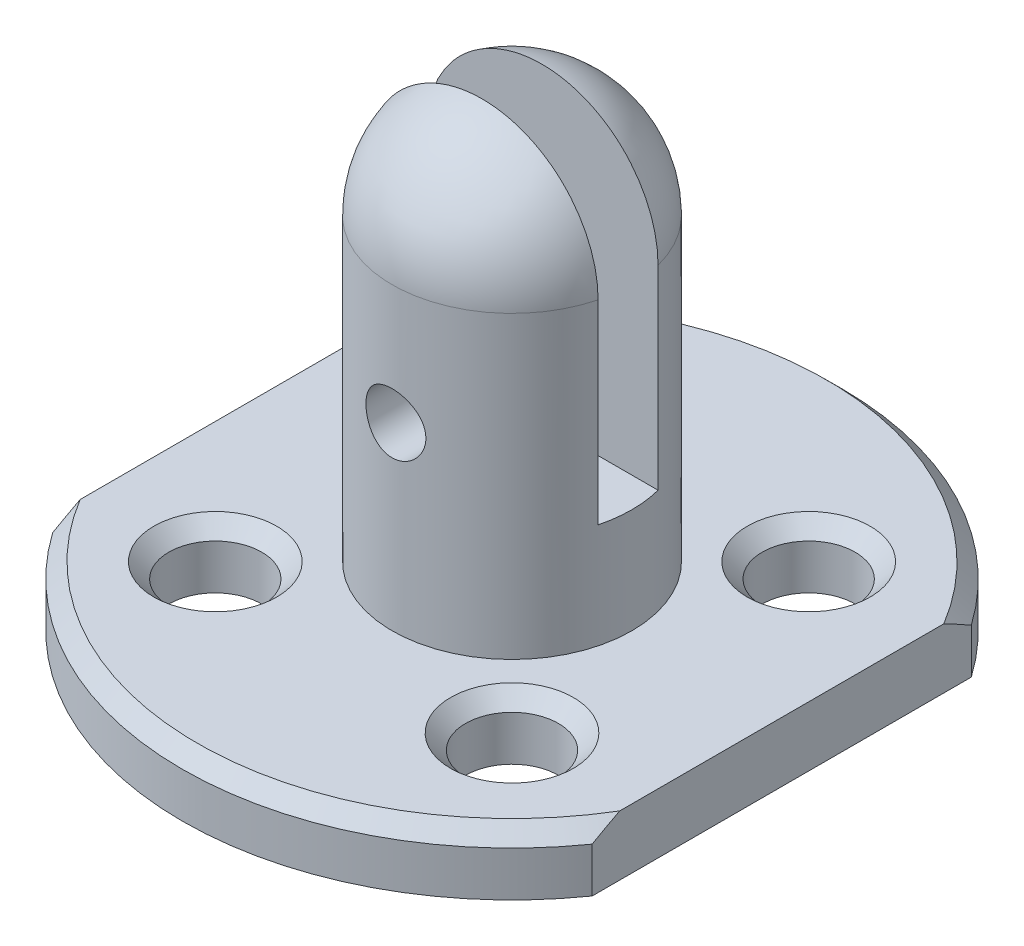
ISO-10303-21;
HEADER;
FILE_DESCRIPTION(('STEP AP214'),'2;1');
FILE_NAME('part.step','',(''),(''),'','','');
FILE_SCHEMA(('AUTOMOTIVE_DESIGN { 1 0 10303 214 1 1 1 1 }'));
ENDSEC;
DATA;
#1=APPLICATION_CONTEXT('core data for automotive mechanical design processes');
#2=APPLICATION_PROTOCOL_DEFINITION('international standard','automotive_design',2000,#1);
#3=PRODUCT_CONTEXT('',#1,'mechanical');
#4=PRODUCT('Part','Part','',(#3));
#5=PRODUCT_RELATED_PRODUCT_CATEGORY('part','',(#4));
#6=PRODUCT_DEFINITION_FORMATION('','',#4);
#7=PRODUCT_DEFINITION_CONTEXT('part definition',#1,'design');
#8=PRODUCT_DEFINITION('design','',#6,#7);
#9=PRODUCT_DEFINITION_SHAPE('','',#8);
#10=(LENGTH_UNIT() NAMED_UNIT(*) SI_UNIT(.MILLI.,.METRE.));
#11=(NAMED_UNIT(*) PLANE_ANGLE_UNIT() SI_UNIT($,.RADIAN.));
#12=(NAMED_UNIT(*) SI_UNIT($,.STERADIAN.) SOLID_ANGLE_UNIT());
#13=UNCERTAINTY_MEASURE_WITH_UNIT(LENGTH_MEASURE(1.E-05),#10,'distance_accuracy_value','');
#14=(GEOMETRIC_REPRESENTATION_CONTEXT(3) GLOBAL_UNCERTAINTY_ASSIGNED_CONTEXT((#13)) GLOBAL_UNIT_ASSIGNED_CONTEXT((#10,
#11,#12)) REPRESENTATION_CONTEXT('',''));
#15=CARTESIAN_POINT('',(0.,0.,0.));
#16=DIRECTION('',(0.,0.,1.));
#17=DIRECTION('',(1.,0.,0.));
#18=AXIS2_PLACEMENT_3D('',#15,#16,#17);
#19=CARTESIAN_POINT('',(0.,2.,0.));
#20=DIRECTION('',(0.,-1.,0.));
#21=DIRECTION('',(1.,0.,0.));
#22=AXIS2_PLACEMENT_3D('',#19,#20,#21);
#23=CYLINDRICAL_SURFACE('',#22,4.);
#24=CARTESIAN_POINT('',(1.,8.,-3.87298334620742));
#25=CARTESIAN_POINT('',(0.999998431438699,7.94477969964322,-3.87298440057185));
#26=CARTESIAN_POINT('',(0.99541049820807,7.88954204056864,-3.87417722499279));
#27=CARTESIAN_POINT('',(0.977209250194446,7.78065296876739,-3.87880744892249));
#28=CARTESIAN_POINT('',(0.963590682698078,7.72700249822004,-3.88224615474181));
#29=CARTESIAN_POINT('',(0.927796479849635,7.62287858471216,-3.89095489813012));
#30=CARTESIAN_POINT('',(0.905631891140944,7.57240113784224,-3.8962225706936));
#31=CARTESIAN_POINT('',(0.853408456505407,7.47587565898752,-3.90799276818327));
#32=CARTESIAN_POINT('',(0.823349275424505,7.42982781516885,-3.91449534553241));
#33=CARTESIAN_POINT('',(0.755483370924517,7.34245534189415,-3.92816286540368));
#34=CARTESIAN_POINT('',(0.717534755081557,7.30124255985972,-3.93533839048709));
#35=CARTESIAN_POINT('',(0.635272825640328,7.22569544225612,-3.94945150206622));
#36=CARTESIAN_POINT('',(0.590958917672139,7.19136174975137,-3.95638906626691));
#37=CARTESIAN_POINT('',(0.496458080431564,7.13008981294742,-3.96936166208095));
#38=CARTESIAN_POINT('',(0.446197830478043,7.10326144473539,-3.975382749602));
#39=CARTESIAN_POINT('',(0.34170527371711,7.05847614233878,-3.98572324770431));
#40=CARTESIAN_POINT('',(0.287473554316778,7.0405178992338,-3.99004290933748));
#41=CARTESIAN_POINT('',(0.177743503501664,7.01434086616856,-3.99641903539263));
#42=CARTESIAN_POINT('',(0.12229308781959,7.00593214226937,-3.99851957537723));
#43=CARTESIAN_POINT('',(0.0107315277051083,6.99849664828978,-4.00037437642922));
#44=CARTESIAN_POINT('',(-0.0453795178152272,6.99946849111616,-4.00012898438682));
#45=CARTESIAN_POINT('',(-0.155352247172387,7.01062994010006,-3.99735237981413));
#46=CARTESIAN_POINT('',(-0.209236215601067,7.02061453002154,-3.9948720093635));
#47=CARTESIAN_POINT('',(-0.314538247413686,7.0491885080194,-3.98796334609942));
#48=CARTESIAN_POINT('',(-0.365956179370438,7.06777835415096,-3.98353494959377));
#49=CARTESIAN_POINT('',(-0.465406703501807,7.11320102827483,-3.97315003880358));
#50=CARTESIAN_POINT('',(-0.513404509766505,7.1401068178647,-3.96718007878022));
#51=CARTESIAN_POINT('',(-0.604275622340489,7.2013422716465,-3.9543596152386));
#52=CARTESIAN_POINT('',(-0.647148035085505,7.23567322742425,-3.94750895860996));
#53=CARTESIAN_POINT('',(-0.727774035084956,7.31188349679295,-3.93345485507808));
#54=CARTESIAN_POINT('',(-0.765357679075199,7.35394195693911,-3.92624687810367));
#55=CARTESIAN_POINT('',(-0.832976375963019,7.4438399894161,-3.91246017406683));
#56=CARTESIAN_POINT('',(-0.863011076046017,7.4916798317964,-3.90588147642388));
#57=CARTESIAN_POINT('',(-0.914788129022598,7.59211601365959,-3.8940819873266));
#58=CARTESIAN_POINT('',(-0.936489566970491,7.64473429212528,-3.88886793490289));
#59=CARTESIAN_POINT('',(-0.970685620636341,7.75303418723058,-3.88047456055983));
#60=CARTESIAN_POINT('',(-0.98318220655291,7.80871514559325,-3.87729480324088));
#61=CARTESIAN_POINT('',(-0.998331855466071,7.91998380060925,-3.87342142415656));
#62=CARTESIAN_POINT('',(-1.00123618956785,7.97553511733185,-3.87266435637459));
#63=CARTESIAN_POINT('',(-0.997806796206219,8.08632877463126,-3.87354937392416));
#64=CARTESIAN_POINT('',(-0.99147391913952,8.1415711431805,-3.87519123840507));
#65=CARTESIAN_POINT('',(-0.969970185575065,8.24924570598188,-3.88062832781824));
#66=CARTESIAN_POINT('',(-0.954945627312699,8.30170909062834,-3.8843878809375));
#67=CARTESIAN_POINT('',(-0.916647232668249,8.40337258314067,-3.89360287308385));
#68=CARTESIAN_POINT('',(-0.893372419085019,8.45257230362214,-3.89905851299446));
#69=CARTESIAN_POINT('',(-0.838708267174624,8.54737651114694,-3.91118454837305));
#70=CARTESIAN_POINT('',(-0.807168701534253,8.59289153601724,-3.91787667442657));
#71=CARTESIAN_POINT('',(-0.737060292934457,8.67807534512054,-3.93166833228686));
#72=CARTESIAN_POINT('',(-0.69849029480544,8.71774316666003,-3.93876793091388));
#73=CARTESIAN_POINT('',(-0.614262720984726,8.79112441702838,-3.95278961212643));
#74=CARTESIAN_POINT('',(-0.568451952531592,8.82466402501953,-3.95970280824734));
#75=CARTESIAN_POINT('',(-0.471702682694675,8.8835743467805,-3.97238886645494));
#76=CARTESIAN_POINT('',(-0.420764448957591,8.90894548664328,-3.97816178801584));
#77=CARTESIAN_POINT('',(-0.31555820173109,8.95057841381117,-3.98788046295326));
#78=CARTESIAN_POINT('',(-0.261317381027881,8.96690571375162,-3.99183932008964));
#79=CARTESIAN_POINT('',(-0.150749760318808,8.99018413384337,-3.99754117358315));
#80=CARTESIAN_POINT('',(-0.0944233650412434,8.99713706349562,-3.99928459757364));
#81=CARTESIAN_POINT('',(0.0170835264433263,9.00136758957554,-4.00034169408811));
#82=CARTESIAN_POINT('',(0.0722538269660329,8.99890170909539,-3.99971978880009));
#83=CARTESIAN_POINT('',(0.181367496414739,8.98495217270567,-3.99625896457424));
#84=CARTESIAN_POINT('',(0.235310901780887,8.9734687849869,-3.99342011157095));
#85=CARTESIAN_POINT('',(0.340171035644816,8.94194778022907,-3.98585432853963));
#86=CARTESIAN_POINT('',(0.391102494581019,8.92195654668538,-3.98113764502669));
#87=CARTESIAN_POINT('',(0.488917053041468,8.87402942098067,-3.97031288913382));
#88=CARTESIAN_POINT('',(0.535799641265051,8.84609252733043,-3.96420464137727));
#89=CARTESIAN_POINT('',(0.6254019284239,8.78228476600293,-3.95107249681343));
#90=CARTESIAN_POINT('',(0.667994988300587,8.74623985709263,-3.94403016945647));
#91=CARTESIAN_POINT('',(0.746615020271251,8.66757714802619,-3.92990649053207));
#92=CARTESIAN_POINT('',(0.782640325068177,8.62495768390206,-3.92282512952424));
#93=CARTESIAN_POINT('',(0.84776202647924,8.53339858579871,-3.90927475860683));
#94=CARTESIAN_POINT('',(0.876716619446594,8.48435587658752,-3.90281963730391));
#95=CARTESIAN_POINT('',(0.925926896615622,8.38194451007715,-3.8914395555011));
#96=CARTESIAN_POINT('',(0.946188909759557,8.32857903389271,-3.88651348244814));
#97=CARTESIAN_POINT('',(0.974422528565571,8.22942298817373,-3.87951908741315));
#98=CARTESIAN_POINT('',(0.983993170595829,8.18410683561764,-3.87708663005761));
#99=CARTESIAN_POINT('',(0.996782292572819,8.09253113099854,-3.87381838580358));
#100=CARTESIAN_POINT('',(1.00000131437052,8.04627165974937,-3.87298246270639));
#101=CARTESIAN_POINT('',(1.,8.,-3.87298334620742));
#102=B_SPLINE_CURVE_WITH_KNOTS('',3,(#24,#25,#26,#27,#28,#29,#30,#31,#32,#33,#34,#35,#36,#37,
#38,#39,#40,#41,#42,#43,#44,#45,#46,#47,#48,#49,#50,#51,#52,#53,#54,#55,#56,#57,#58,#59,#60,#61,
#62,#63,#64,#65,#66,#67,#68,#69,#70,#71,#72,#73,#74,#75,#76,#77,#78,#79,#80,#81,#82,#83,#84,#85,
#86,#87,#88,#89,#90,#91,#92,#93,#94,#95,#96,#97,#98,#99,#100,#101),.UNSPECIFIED.,.T.,.F.,(4,2,2,
2,2,2,2,2,2,2,2,2,2,2,2,2,2,2,2,2,2,2,2,2,2,2,2,2,2,2,2,2,2,2,2,2,2,2,4),(0.,0.165490976675229,
0.331078296534211,0.496452290829153,0.661833306984659,0.83049581673465,0.999174085882212,
1.17020598555443,1.34121263935111,1.50875500394413,1.67627259462683,1.84007305071853,
2.00388222686189,2.16917149698052,2.3344895418384,2.50428186625039,2.67408212476195,
2.84470572799636,3.01529280048093,3.18137429900961,3.34744050869795,3.51078961999957,
3.67415808564842,3.84073138339937,4.00733207550292,4.17810132382402,4.34886166284096,
4.51836829119046,4.6878421955989,4.85273378447257,5.01762046947067,5.18161950620159,
5.34563922291504,5.51358838629103,5.68158012622478,5.85270590910146,6.02370688542922,
6.16239130867206,6.30106390036083),.UNSPECIFIED.);
#103=CARTESIAN_POINT('',(1.,8.,-3.87298334620742));
#104=VERTEX_POINT('',#103);
#105=EDGE_CURVE('E129',#104,#104,#102,.T.);
#106=ORIENTED_EDGE('',*,*,#105,.F.);
#107=EDGE_LOOP('',(#106));
#108=FACE_BOUND('',#107,.T.);
#109=CARTESIAN_POINT('',(1.,8.,3.87298334620742));
#110=CARTESIAN_POINT('',(0.999998431438699,8.05522030035679,3.87298440057185));
#111=CARTESIAN_POINT('',(0.99541049820807,8.11045795943136,3.87417722499279));
#112=CARTESIAN_POINT('',(0.977209250194446,8.21934703123261,3.87880744892249));
#113=CARTESIAN_POINT('',(0.963590682698078,8.27299750177997,3.88224615474181));
#114=CARTESIAN_POINT('',(0.927796479849635,8.37712141528784,3.89095489813012));
#115=CARTESIAN_POINT('',(0.905631891140944,8.42759886215776,3.8962225706936));
#116=CARTESIAN_POINT('',(0.853408456505407,8.52412434101248,3.90799276818327));
#117=CARTESIAN_POINT('',(0.823349275424505,8.57017218483115,3.91449534553241));
#118=CARTESIAN_POINT('',(0.755483370924518,8.65754465810585,3.92816286540368));
#119=CARTESIAN_POINT('',(0.717534755081558,8.69875744014028,3.93533839048709));
#120=CARTESIAN_POINT('',(0.635272825640329,8.77430455774388,3.94945150206622));
#121=CARTESIAN_POINT('',(0.590958917672141,8.80863825024863,3.95638906626691));
#122=CARTESIAN_POINT('',(0.496458080431566,8.86991018705258,3.96936166208095));
#123=CARTESIAN_POINT('',(0.446197830478045,8.8967385552646,3.975382749602));
#124=CARTESIAN_POINT('',(0.34170527371711,8.94152385766122,3.98572324770431));
#125=CARTESIAN_POINT('',(0.287473554316778,8.9594821007662,3.99004290933748));
#126=CARTESIAN_POINT('',(0.177743503501663,8.98565913383144,3.99641903539263));
#127=CARTESIAN_POINT('',(0.122293087819589,8.99406785773063,3.99851957537723));
#128=CARTESIAN_POINT('',(0.0107315277051076,9.00150335171022,4.00037437642922));
#129=CARTESIAN_POINT('',(-0.0453795178152278,9.00053150888384,4.00012898438682));
#130=CARTESIAN_POINT('',(-0.155352247172388,8.98937005989994,3.99735237981413));
#131=CARTESIAN_POINT('',(-0.209236215601068,8.97938546997846,3.9948720093635));
#132=CARTESIAN_POINT('',(-0.314538247413687,8.9508114919806,3.98796334609942));
#133=CARTESIAN_POINT('',(-0.365956179370439,8.93222164584904,3.98353494959377));
#134=CARTESIAN_POINT('',(-0.465406703501807,8.88679897172517,3.97315003880358));
#135=CARTESIAN_POINT('',(-0.513404509766505,8.8598931821353,3.96718007878022));
#136=CARTESIAN_POINT('',(-0.60427562234049,8.7986577283535,3.9543596152386));
#137=CARTESIAN_POINT('',(-0.647148035085506,8.76432677257575,3.94750895860996));
#138=CARTESIAN_POINT('',(-0.727774035084957,8.68811650320705,3.93345485507808));
#139=CARTESIAN_POINT('',(-0.7653576790752,8.64605804306089,3.92624687810367));
#140=CARTESIAN_POINT('',(-0.832976375963019,8.5561600105839,3.91246017406683));
#141=CARTESIAN_POINT('',(-0.863011076046017,8.5083201682036,3.90588147642388));
#142=CARTESIAN_POINT('',(-0.914788129022599,8.40788398634041,3.8940819873266));
#143=CARTESIAN_POINT('',(-0.936489566970491,8.35526570787472,3.88886793490289));
#144=CARTESIAN_POINT('',(-0.970685620636341,8.24696581276942,3.88047456055983));
#145=CARTESIAN_POINT('',(-0.98318220655291,8.19128485440675,3.87729480324088));
#146=CARTESIAN_POINT('',(-0.998331855466071,8.08001619939075,3.87342142415656));
#147=CARTESIAN_POINT('',(-1.00123618956785,8.02446488266815,3.87266435637459));
#148=CARTESIAN_POINT('',(-0.997806796206219,7.91367122536874,3.87354937392416));
#149=CARTESIAN_POINT('',(-0.99147391913952,7.8584288568195,3.87519123840507));
#150=CARTESIAN_POINT('',(-0.969970185575065,7.75075429401812,3.88062832781824));
#151=CARTESIAN_POINT('',(-0.954945627312698,7.69829090937166,3.8843878809375));
#152=CARTESIAN_POINT('',(-0.916647232668248,7.59662741685933,3.89360287308385));
#153=CARTESIAN_POINT('',(-0.893372419085018,7.54742769637786,3.89905851299446));
#154=CARTESIAN_POINT('',(-0.838708267174623,7.45262348885306,3.91118454837305));
#155=CARTESIAN_POINT('',(-0.807168701534252,7.40710846398276,3.91787667442657));
#156=CARTESIAN_POINT('',(-0.737060292934456,7.32192465487946,3.93166833228687));
#157=CARTESIAN_POINT('',(-0.69849029480544,7.28225683333997,3.93876793091388));
#158=CARTESIAN_POINT('',(-0.614262720984726,7.20887558297162,3.95278961212643));
#159=CARTESIAN_POINT('',(-0.568451952531592,7.17533597498047,3.95970280824734));
#160=CARTESIAN_POINT('',(-0.471702682694675,7.1164256532195,3.97238886645494));
#161=CARTESIAN_POINT('',(-0.420764448957591,7.09105451335672,3.97816178801584));
#162=CARTESIAN_POINT('',(-0.31555820173109,7.04942158618883,3.98788046295326));
#163=CARTESIAN_POINT('',(-0.261317381027882,7.03309428624838,3.99183932008964));
#164=CARTESIAN_POINT('',(-0.150749760318808,7.00981586615663,3.99754117358315));
#165=CARTESIAN_POINT('',(-0.0944233650412438,7.00286293650438,3.99928459757364));
#166=CARTESIAN_POINT('',(0.0170835264433264,6.99863241042447,4.00034169408811));
#167=CARTESIAN_POINT('',(0.0722538269660333,7.00109829090461,3.99971978880009));
#168=CARTESIAN_POINT('',(0.18136749641474,7.01504782729433,3.99625896457424));
#169=CARTESIAN_POINT('',(0.235310901780887,7.0265312150131,3.99342011157095));
#170=CARTESIAN_POINT('',(0.340171035644817,7.05805221977093,3.98585432853964));
#171=CARTESIAN_POINT('',(0.39110249458102,7.07804345331462,3.98113764502669));
#172=CARTESIAN_POINT('',(0.488917053041469,7.12597057901933,3.97031288913382));
#173=CARTESIAN_POINT('',(0.535799641265051,7.15390747266957,3.96420464137727));
#174=CARTESIAN_POINT('',(0.625401928423901,7.21771523399707,3.95107249681343));
#175=CARTESIAN_POINT('',(0.667994988300588,7.25376014290737,3.94403016945647));
#176=CARTESIAN_POINT('',(0.746615020271253,7.33242285197381,3.92990649053207));
#177=CARTESIAN_POINT('',(0.782640325068179,7.37504231609795,3.92282512952424));
#178=CARTESIAN_POINT('',(0.847762026479241,7.4666014142013,3.90927475860683));
#179=CARTESIAN_POINT('',(0.876716619446594,7.51564412341248,3.90281963730391));
#180=CARTESIAN_POINT('',(0.925926896615623,7.61805548992285,3.8914395555011));
#181=CARTESIAN_POINT('',(0.946188909759557,7.67142096610729,3.88651348244814));
#182=CARTESIAN_POINT('',(0.974422528565572,7.77057701182628,3.87951908741315));
#183=CARTESIAN_POINT('',(0.983993170595829,7.81589316438236,3.87708663005761));
#184=CARTESIAN_POINT('',(0.99678229257282,7.90746886900147,3.87381838580358));
#185=CARTESIAN_POINT('',(1.00000131437052,7.95372834025063,3.87298246270639));
#186=CARTESIAN_POINT('',(1.,8.,3.87298334620742));
#187=B_SPLINE_CURVE_WITH_KNOTS('',3,(#109,#110,#111,#112,#113,#114,#115,#116,#117,#118,#119,
#120,#121,#122,#123,#124,#125,#126,#127,#128,#129,#130,#131,#132,#133,#134,#135,#136,#137,#138,
#139,#140,#141,#142,#143,#144,#145,#146,#147,#148,#149,#150,#151,#152,#153,#154,#155,#156,#157,
#158,#159,#160,#161,#162,#163,#164,#165,#166,#167,#168,#169,#170,#171,#172,#173,#174,#175,#176,
#177,#178,#179,#180,#181,#182,#183,#184,#185,#186),.UNSPECIFIED.,.T.,.F.,(4,2,2,2,2,2,2,2,2,2,2,
2,2,2,2,2,2,2,2,2,2,2,2,2,2,2,2,2,2,2,2,2,2,2,2,2,2,2,4),(0.,0.165490976675229,
0.331078296534212,0.496452290829153,0.661833306984659,0.830495816734648,0.99917408588221,
1.17020598555442,1.34121263935111,1.50875500394413,1.67627259462683,1.84007305071853,
2.00388222686189,2.16917149698052,2.3344895418384,2.50428186625039,2.67408212476196,
2.84470572799636,3.01529280048094,3.18137429900961,3.34744050869796,3.51078961999957,
3.67415808564842,3.84073138339938,4.00733207550292,4.17810132382402,4.34886166284096,
4.51836829119046,4.6878421955989,4.85273378447257,5.01762046947067,5.18161950620159,
5.34563922291504,5.51358838629103,5.68158012622479,5.85270590910146,6.02370688542923,
6.16239130867207,6.30106390036083),.UNSPECIFIED.);
#188=CARTESIAN_POINT('',(1.,8.,3.87298334620742));
#189=VERTEX_POINT('',#188);
#190=EDGE_CURVE('E146',#189,#189,#187,.T.);
#191=ORIENTED_EDGE('',*,*,#190,.F.);
#192=EDGE_LOOP('',(#191));
#193=FACE_BOUND('',#192,.T.);
#194=CARTESIAN_POINT('',(0.,2.,0.));
#195=DIRECTION('',(0.,-1.,0.));
#196=DIRECTION('',(1.,0.,0.));
#197=AXIS2_PLACEMENT_3D('',#194,#195,#196);
#198=CIRCLE('',#197,4.);
#199=CARTESIAN_POINT('',(4.,2.,0.));
#200=VERTEX_POINT('',#199);
#201=EDGE_CURVE('E207',#200,#200,#198,.T.);
#202=ORIENTED_EDGE('',*,*,#201,.F.);
#203=EDGE_LOOP('',(#202));
#204=FACE_BOUND('',#203,.T.);
#205=CARTESIAN_POINT('',(0.,5.5,0.));
#206=DIRECTION('',(0.,-1.,0.));
#207=DIRECTION('',(0.,0.,-1.));
#208=AXIS2_PLACEMENT_3D('',#205,#206,#207);
#209=CIRCLE('',#208,4.);
#210=CARTESIAN_POINT('',(3.87298334620741,5.5,1.));
#211=VERTEX_POINT('',#210);
#212=CARTESIAN_POINT('',(3.87298334620741,5.5,-1.));
#213=VERTEX_POINT('',#212);
#214=EDGE_CURVE('E44',#211,#213,#209,.F.);
#215=ORIENTED_EDGE('',*,*,#214,.F.);
#216=DIRECTION('',(0.,-1.,0.));
#217=VECTOR('',#216,1.);
#218=CARTESIAN_POINT('',(3.87298334620742,2.,1.));
#219=LINE('',#218,#217);
#220=CARTESIAN_POINT('',(3.87298334620742,12.,1.));
#221=VERTEX_POINT('',#220);
#222=EDGE_CURVE('E591',#211,#221,#219,.F.);
#223=ORIENTED_EDGE('',*,*,#222,.T.);
#224=CARTESIAN_POINT('',(0.,12.,0.));
#225=DIRECTION('',(0.,-1.,0.));
#226=DIRECTION('',(1.,0.,0.));
#227=AXIS2_PLACEMENT_3D('',#224,#225,#226);
#228=CIRCLE('',#227,4.);
#229=CARTESIAN_POINT('',(-3.87298334620741,12.,1.));
#230=VERTEX_POINT('',#229);
#231=EDGE_CURVE('E210',#221,#230,#228,.T.);
#232=ORIENTED_EDGE('',*,*,#231,.T.);
#233=DIRECTION('',(0.,-1.,0.));
#234=VECTOR('',#233,1.);
#235=CARTESIAN_POINT('',(-3.87298334620742,2.,1.));
#236=LINE('',#235,#234);
#237=CARTESIAN_POINT('',(-3.87298334620742,5.5,1.));
#238=VERTEX_POINT('',#237);
#239=EDGE_CURVE('E133',#230,#238,#236,.T.);
#240=ORIENTED_EDGE('',*,*,#239,.T.);
#241=CARTESIAN_POINT('',(-3.87298334620742,5.5,-1.));
#242=VERTEX_POINT('',#241);
#243=EDGE_CURVE('E126',#242,#238,#209,.F.);
#244=ORIENTED_EDGE('',*,*,#243,.F.);
#245=DIRECTION('',(0.,-1.,0.));
#246=VECTOR('',#245,1.);
#247=CARTESIAN_POINT('',(-3.87298334620742,2.,-0.999999999999999));
#248=LINE('',#247,#246);
#249=CARTESIAN_POINT('',(-3.87298334620741,12.,-0.999999999999999));
#250=VERTEX_POINT('',#249);
#251=EDGE_CURVE('E112',#250,#242,#248,.T.);
#252=ORIENTED_EDGE('',*,*,#251,.F.);
#253=CARTESIAN_POINT('',(3.87298334620742,12.,-0.999999999999999));
#254=VERTEX_POINT('',#253);
#255=EDGE_CURVE('E215',#250,#254,#228,.T.);
#256=ORIENTED_EDGE('',*,*,#255,.T.);
#257=DIRECTION('',(0.,-1.,0.));
#258=VECTOR('',#257,1.);
#259=CARTESIAN_POINT('',(3.87298334620742,2.,-0.999999999999999));
#260=LINE('',#259,#258);
#261=EDGE_CURVE('E51',#213,#254,#260,.F.);
#262=ORIENTED_EDGE('',*,*,#261,.F.);
#263=EDGE_LOOP('',(#215,#223,#232,#240,#244,#252,#256,#262));
#264=FACE_BOUND('',#263,.T.);
#265=ADVANCED_FACE('F34',(#108,#193,#204,#264),#23,.T.);
#266=CARTESIAN_POINT('',(0.,12.,0.));
#267=DIRECTION('',(0.,-1.,0.));
#268=DIRECTION('',(1.,0.,0.));
#269=AXIS2_PLACEMENT_3D('',#266,#267,#268);
#270=SPHERICAL_SURFACE('',#269,4.);
#271=ORIENTED_EDGE('',*,*,#231,.F.);
#272=CARTESIAN_POINT('',(0.,12.,1.));
#273=DIRECTION('',(0.,0.,-1.));
#274=DIRECTION('',(-1.,0.,0.));
#275=AXIS2_PLACEMENT_3D('',#272,#273,#274);
#276=CIRCLE('',#275,3.87298334620741);
#277=EDGE_CURVE('E134',#221,#230,#276,.F.);
#278=ORIENTED_EDGE('',*,*,#277,.T.);
#279=EDGE_LOOP('',(#271,#278));
#280=FACE_BOUND('',#279,.T.);
#281=ADVANCED_FACE('F187',(#280),#270,.T.);
#282=CARTESIAN_POINT('',(0.,2.,0.));
#283=DIRECTION('',(0.,-1.,0.));
#284=DIRECTION('',(0.,0.,-1.));
#285=AXIS2_PLACEMENT_3D('',#282,#283,#284);
#286=CYLINDRICAL_SURFACE('',#285,11.);
#287=DIRECTION('',(0.,-1.,0.));
#288=VECTOR('',#287,1.);
#289=CARTESIAN_POINT('',(8.99999999999999,2.,6.32455532033676));
#290=LINE('',#289,#288);
#291=CARTESIAN_POINT('',(8.99999999999999,1.5,6.32455532033676));
#292=VERTEX_POINT('',#291);
#293=CARTESIAN_POINT('',(8.99999999999999,0.,6.32455532033676));
#294=VERTEX_POINT('',#293);
#295=EDGE_CURVE('E251',#292,#294,#290,.T.);
#296=ORIENTED_EDGE('',*,*,#295,.F.);
#297=CARTESIAN_POINT('',(0.,1.5,0.));
#298=DIRECTION('',(0.,1.,0.));
#299=DIRECTION('',(0.,0.,1.));
#300=AXIS2_PLACEMENT_3D('',#297,#298,#299);
#301=CIRCLE('',#300,11.);
#302=CARTESIAN_POINT('',(-9.,1.5,6.32455532033676));
#303=VERTEX_POINT('',#302);
#304=EDGE_CURVE('E397',#292,#303,#301,.F.);
#305=ORIENTED_EDGE('',*,*,#304,.T.);
#306=DIRECTION('',(0.,-1.,0.));
#307=VECTOR('',#306,1.);
#308=CARTESIAN_POINT('',(-9.,2.,6.32455532033676));
#309=LINE('',#308,#307);
#310=CARTESIAN_POINT('',(-9.,0.,6.32455532033676));
#311=VERTEX_POINT('',#310);
#312=EDGE_CURVE('E235',#303,#311,#309,.T.);
#313=ORIENTED_EDGE('',*,*,#312,.T.);
#314=CARTESIAN_POINT('',(0.,0.,0.));
#315=DIRECTION('',(0.,1.,0.));
#316=DIRECTION('',(0.,0.,1.));
#317=AXIS2_PLACEMENT_3D('',#314,#315,#316);
#318=CIRCLE('',#317,11.);
#319=EDGE_CURVE('E227',#311,#294,#318,.T.);
#320=ORIENTED_EDGE('',*,*,#319,.T.);
#321=EDGE_LOOP('',(#296,#305,#313,#320));
#322=FACE_BOUND('',#321,.T.);
#323=ADVANCED_FACE('F194',(#322),#286,.T.);
#324=CARTESIAN_POINT('',(8.99999999999999,2.,6.32455532033676));
#325=DIRECTION('',(-1.,0.,0.));
#326=DIRECTION('',(0.,0.,1.));
#327=AXIS2_PLACEMENT_3D('',#324,#325,#326);
#328=PLANE('',#327);
#329=DIRECTION('',(0.,0.,-1.));
#330=VECTOR('',#329,1.);
#331=CARTESIAN_POINT('',(8.99999999999999,2.,6.32455532033676));
#332=LINE('',#331,#330);
#333=CARTESIAN_POINT('',(8.99999999999999,2.,5.40832691319599));
#334=VERTEX_POINT('',#333);
#335=CARTESIAN_POINT('',(9.,2.,-5.40832691319599));
#336=VERTEX_POINT('',#335);
#337=EDGE_CURVE('E228',#334,#336,#332,.T.);
#338=ORIENTED_EDGE('',*,*,#337,.F.);
#339=CARTESIAN_POINT('',(8.99999999999999,2.,5.40832691319599));
#340=CARTESIAN_POINT('',(8.99999999999999,1.9601636196947,5.48566617301226));
#341=CARTESIAN_POINT('',(8.99999999999999,1.91983232897873,5.56274968894725));
#342=CARTESIAN_POINT('',(8.99999999999999,1.8382408505784,5.71641052130727));
#343=CARTESIAN_POINT('',(8.99999999999999,1.79698078713673,5.79298790368605));
#344=CARTESIAN_POINT('',(8.99999999999999,1.71358246931802,5.94566157378086));
#345=CARTESIAN_POINT('',(8.99999999999999,1.67144422351644,6.02175786618529));
#346=CARTESIAN_POINT('',(8.99999999999999,1.5863337645416,6.17349604753122));
#347=CARTESIAN_POINT('',(8.99999999999999,1.54336144120018,6.24913787469337));
#348=CARTESIAN_POINT('',(8.99999999999999,1.50000000000006,6.32455532033679));
#349=B_SPLINE_CURVE_WITH_KNOTS('',3,(#339,#340,#341,#342,#343,#344,#345,#346,#347,#348),
.UNSPECIFIED.,.F.,.F.,(4,2,2,2,4),(0.,0.260985065974221,0.521935424830135,0.782883236700202,
1.04386575332713),.UNSPECIFIED.);
#350=EDGE_CURVE('E290',#334,#292,#349,.T.);
#351=ORIENTED_EDGE('',*,*,#350,.T.);
#352=ORIENTED_EDGE('',*,*,#295,.T.);
#353=DIRECTION('',(0.,0.,-1.));
#354=VECTOR('',#353,1.);
#355=CARTESIAN_POINT('',(8.99999999999999,0.,6.32455532033676));
#356=LINE('',#355,#354);
#357=CARTESIAN_POINT('',(9.,0.,-6.32455532033676));
#358=VERTEX_POINT('',#357);
#359=EDGE_CURVE('E238',#294,#358,#356,.T.);
#360=ORIENTED_EDGE('',*,*,#359,.T.);
#361=DIRECTION('',(0.,-1.,0.));
#362=VECTOR('',#361,1.);
#363=CARTESIAN_POINT('',(9.,2.,-6.32455532033676));
#364=LINE('',#363,#362);
#365=CARTESIAN_POINT('',(9.,1.5,-6.32455532033676));
#366=VERTEX_POINT('',#365);
#367=EDGE_CURVE('E249',#366,#358,#364,.T.);
#368=ORIENTED_EDGE('',*,*,#367,.F.);
#369=CARTESIAN_POINT('',(9.,1.5,-6.32455532033676));
#370=CARTESIAN_POINT('',(9.,1.54336144120015,-6.24913787469335));
#371=CARTESIAN_POINT('',(9.,1.58633376454159,-6.17349604753121));
#372=CARTESIAN_POINT('',(9.,1.67144422351644,-6.02175786618529));
#373=CARTESIAN_POINT('',(9.,1.71358246931803,-5.94566157378086));
#374=CARTESIAN_POINT('',(9.,1.79698078713672,-5.79298790368605));
#375=CARTESIAN_POINT('',(9.,1.83824085057838,-5.71641052130726));
#376=CARTESIAN_POINT('',(9.,1.91983232897874,-5.56274968894725));
#377=CARTESIAN_POINT('',(9.,1.96016361969474,-5.48566617301228));
#378=CARTESIAN_POINT('',(9.,2.00000000000012,-5.40832691319605));
#379=B_SPLINE_CURVE_WITH_KNOTS('',3,(#369,#370,#371,#372,#373,#374,#375,#376,#377,#378),
.UNSPECIFIED.,.F.,.F.,(4,2,2,2,4),(0.,0.260982516626927,0.521930328496995,0.782880687352909,
1.04386575332713),.UNSPECIFIED.);
#380=EDGE_CURVE('E283',#366,#336,#379,.T.);
#381=ORIENTED_EDGE('',*,*,#380,.T.);
#382=EDGE_LOOP('',(#338,#351,#352,#360,#368,#381));
#383=FACE_BOUND('',#382,.T.);
#384=ADVANCED_FACE('F296',(#383),#328,.F.);
#385=CARTESIAN_POINT('',(0.,2.,0.));
#386=DIRECTION('',(0.,-1.,0.));
#387=DIRECTION('',(0.,0.,-1.));
#388=AXIS2_PLACEMENT_3D('',#385,#386,#387);
#389=CYLINDRICAL_SURFACE('',#388,11.);
#390=DIRECTION('',(0.,-1.,0.));
#391=VECTOR('',#390,1.);
#392=CARTESIAN_POINT('',(-9.,2.,-6.32455532033676));
#393=LINE('',#392,#391);
#394=CARTESIAN_POINT('',(-9.,1.5,-6.32455532033676));
#395=VERTEX_POINT('',#394);
#396=CARTESIAN_POINT('',(-9.,0.,-6.32455532033676));
#397=VERTEX_POINT('',#396);
#398=EDGE_CURVE('E247',#395,#397,#393,.T.);
#399=ORIENTED_EDGE('',*,*,#398,.F.);
#400=CARTESIAN_POINT('',(0.,1.5,0.));
#401=DIRECTION('',(0.,1.,0.));
#402=DIRECTION('',(0.,0.,1.));
#403=AXIS2_PLACEMENT_3D('',#400,#401,#402);
#404=CIRCLE('',#403,11.);
#405=EDGE_CURVE('E351',#395,#366,#404,.F.);
#406=ORIENTED_EDGE('',*,*,#405,.T.);
#407=ORIENTED_EDGE('',*,*,#367,.T.);
#408=CARTESIAN_POINT('',(0.,0.,0.));
#409=DIRECTION('',(0.,1.,0.));
#410=DIRECTION('',(0.,0.,1.));
#411=AXIS2_PLACEMENT_3D('',#408,#409,#410);
#412=CIRCLE('',#411,11.);
#413=EDGE_CURVE('E241',#358,#397,#412,.T.);
#414=ORIENTED_EDGE('',*,*,#413,.T.);
#415=EDGE_LOOP('',(#399,#406,#407,#414));
#416=FACE_BOUND('',#415,.T.);
#417=ADVANCED_FACE('F301',(#416),#389,.T.);
#418=CARTESIAN_POINT('',(-9.,2.,6.32455532033676));
#419=DIRECTION('',(1.,0.,0.));
#420=DIRECTION('',(0.,0.,-1.));
#421=AXIS2_PLACEMENT_3D('',#418,#419,#420);
#422=PLANE('',#421);
#423=ORIENTED_EDGE('',*,*,#312,.F.);
#424=CARTESIAN_POINT('',(-9.,1.5,6.32455532033676));
#425=CARTESIAN_POINT('',(-9.,1.54336144120015,6.24913787469335));
#426=CARTESIAN_POINT('',(-9.,1.58633376454159,6.1734960475312));
#427=CARTESIAN_POINT('',(-9.,1.67144422351644,6.02175786618528));
#428=CARTESIAN_POINT('',(-9.,1.71358246931803,5.94566157378086));
#429=CARTESIAN_POINT('',(-9.,1.79698078713672,5.79298790368604));
#430=CARTESIAN_POINT('',(-9.,1.83824085057838,5.71641052130725));
#431=CARTESIAN_POINT('',(-9.,1.91983232897874,5.56274968894725));
#432=CARTESIAN_POINT('',(-9.,1.96016361969474,5.48566617301227));
#433=CARTESIAN_POINT('',(-9.,2.00000000000012,5.40832691319605));
#434=B_SPLINE_CURVE_WITH_KNOTS('',3,(#424,#425,#426,#427,#428,#429,#430,#431,#432,#433),
.UNSPECIFIED.,.F.,.F.,(4,2,2,2,4),(0.,0.260982516626926,0.521930328496996,0.782880687352909,
1.04386575332713),.UNSPECIFIED.);
#435=CARTESIAN_POINT('',(-9.,2.,5.40832691319598));
#436=VERTEX_POINT('',#435);
#437=EDGE_CURVE('E344',#303,#436,#434,.T.);
#438=ORIENTED_EDGE('',*,*,#437,.T.);
#439=DIRECTION('',(0.,0.,1.));
#440=VECTOR('',#439,1.);
#441=CARTESIAN_POINT('',(-9.,2.,6.32455532033676));
#442=LINE('',#441,#440);
#443=CARTESIAN_POINT('',(-9.,2.,-5.40832691319598));
#444=VERTEX_POINT('',#443);
#445=EDGE_CURVE('E231',#444,#436,#442,.T.);
#446=ORIENTED_EDGE('',*,*,#445,.F.);
#447=CARTESIAN_POINT('',(-9.,2.,-5.40832691319598));
#448=CARTESIAN_POINT('',(-9.,1.9601636196947,-5.48566617301225));
#449=CARTESIAN_POINT('',(-9.,1.91983232897873,-5.56274968894724));
#450=CARTESIAN_POINT('',(-9.,1.8382408505784,-5.71641052130726));
#451=CARTESIAN_POINT('',(-9.,1.79698078713673,-5.79298790368604));
#452=CARTESIAN_POINT('',(-9.,1.71358246931802,-5.94566157378086));
#453=CARTESIAN_POINT('',(-9.,1.67144422351644,-6.02175786618528));
#454=CARTESIAN_POINT('',(-9.,1.5863337645416,-6.17349604753121));
#455=CARTESIAN_POINT('',(-9.,1.54336144120017,-6.24913787469336));
#456=CARTESIAN_POINT('',(-9.,1.50000000000005,-6.32455532033679));
#457=B_SPLINE_CURVE_WITH_KNOTS('',3,(#447,#448,#449,#450,#451,#452,#453,#454,#455,#456),
.UNSPECIFIED.,.F.,.F.,(4,2,2,2,4),(0.,0.260985065974224,0.521935424830141,0.782883236700211,
1.04386575332714),.UNSPECIFIED.);
#458=EDGE_CURVE('E59',#444,#395,#457,.T.);
#459=ORIENTED_EDGE('',*,*,#458,.T.);
#460=ORIENTED_EDGE('',*,*,#398,.T.);
#461=DIRECTION('',(0.,0.,1.));
#462=VECTOR('',#461,1.);
#463=CARTESIAN_POINT('',(-9.,0.,6.32455532033676));
#464=LINE('',#463,#462);
#465=EDGE_CURVE('E232',#397,#311,#464,.T.);
#466=ORIENTED_EDGE('',*,*,#465,.T.);
#467=EDGE_LOOP('',(#423,#438,#446,#459,#460,#466));
#468=FACE_BOUND('',#467,.T.);
#469=ADVANCED_FACE('F356',(#468),#422,.F.);
#470=CARTESIAN_POINT('',(0.,2.,0.));
#471=DIRECTION('',(0.,1.,0.));
#472=DIRECTION('',(0.,0.,1.));
#473=AXIS2_PLACEMENT_3D('',#470,#471,#472);
#474=PLANE('',#473);
#475=ORIENTED_EDGE('',*,*,#201,.T.);
#476=EDGE_LOOP('',(#475));
#477=FACE_BOUND('',#476,.T.);
#478=CARTESIAN_POINT('',(4.94974746830584,2.,4.94974746830582));
#479=DIRECTION('',(0.,1.,0.));
#480=DIRECTION('',(0.,0.,1.));
#481=AXIS2_PLACEMENT_3D('',#478,#479,#480);
#482=CIRCLE('',#481,2.05);
#483=CARTESIAN_POINT('',(4.94974746830584,2.,6.99974746830583));
#484=VERTEX_POINT('',#483);
#485=EDGE_CURVE('E271',#484,#484,#482,.F.);
#486=ORIENTED_EDGE('',*,*,#485,.T.);
#487=EDGE_LOOP('',(#486));
#488=FACE_BOUND('',#487,.T.);
#489=CARTESIAN_POINT('',(4.94974746830582,2.,-4.94974746830584));
#490=DIRECTION('',(0.,1.,0.));
#491=DIRECTION('',(0.,0.,1.));
#492=AXIS2_PLACEMENT_3D('',#489,#490,#491);
#493=CIRCLE('',#492,2.05);
#494=CARTESIAN_POINT('',(4.94974746830582,2.,-2.89974746830584));
#495=VERTEX_POINT('',#494);
#496=EDGE_CURVE('E268',#495,#495,#493,.F.);
#497=ORIENTED_EDGE('',*,*,#496,.T.);
#498=EDGE_LOOP('',(#497));
#499=FACE_BOUND('',#498,.T.);
#500=CARTESIAN_POINT('',(-4.94974746830584,2.,-4.94974746830582));
#501=DIRECTION('',(0.,1.,0.));
#502=DIRECTION('',(0.,0.,1.));
#503=AXIS2_PLACEMENT_3D('',#500,#501,#502);
#504=CIRCLE('',#503,2.05000000000004);
#505=CARTESIAN_POINT('',(-4.94974746830584,2.,-2.89974746830578));
#506=VERTEX_POINT('',#505);
#507=EDGE_CURVE('E265',#506,#506,#504,.F.);
#508=ORIENTED_EDGE('',*,*,#507,.T.);
#509=EDGE_LOOP('',(#508));
#510=FACE_BOUND('',#509,.T.);
#511=CARTESIAN_POINT('',(-4.94974746830582,2.,4.94974746830584));
#512=DIRECTION('',(0.,1.,0.));
#513=DIRECTION('',(0.,0.,1.));
#514=AXIS2_PLACEMENT_3D('',#511,#512,#513);
#515=CIRCLE('',#514,2.05000000000002);
#516=CARTESIAN_POINT('',(-4.94974746830582,2.,6.99974746830587));
#517=VERTEX_POINT('',#516);
#518=EDGE_CURVE('E262',#517,#517,#515,.F.);
#519=ORIENTED_EDGE('',*,*,#518,.T.);
#520=EDGE_LOOP('',(#519));
#521=FACE_BOUND('',#520,.T.);
#522=ORIENTED_EDGE('',*,*,#445,.T.);
#523=CARTESIAN_POINT('',(0.,2.,0.));
#524=DIRECTION('',(0.,1.,0.));
#525=DIRECTION('',(0.,0.,1.));
#526=AXIS2_PLACEMENT_3D('',#523,#524,#525);
#527=CIRCLE('',#526,10.5);
#528=EDGE_CURVE('E259',#436,#334,#527,.T.);
#529=ORIENTED_EDGE('',*,*,#528,.T.);
#530=ORIENTED_EDGE('',*,*,#337,.T.);
#531=CARTESIAN_POINT('',(0.,2.,0.));
#532=DIRECTION('',(0.,1.,0.));
#533=DIRECTION('',(0.,0.,1.));
#534=AXIS2_PLACEMENT_3D('',#531,#532,#533);
#535=CIRCLE('',#534,10.5);
#536=EDGE_CURVE('E256',#336,#444,#535,.T.);
#537=ORIENTED_EDGE('',*,*,#536,.T.);
#538=EDGE_LOOP('',(#522,#529,#530,#537));
#539=FACE_BOUND('',#538,.T.);
#540=ADVANCED_FACE('F360',(#477,#488,#499,#510,#521,#539),#474,.T.);
#541=CARTESIAN_POINT('',(0.,0.,0.));
#542=DIRECTION('',(0.,1.,0.));
#543=DIRECTION('',(0.,0.,1.));
#544=AXIS2_PLACEMENT_3D('',#541,#542,#543);
#545=PLANE('',#544);
#546=CARTESIAN_POINT('',(0.,0.,0.));
#547=DIRECTION('',(0.,1.,0.));
#548=DIRECTION('',(0.,0.,1.));
#549=AXIS2_PLACEMENT_3D('',#546,#547,#548);
#550=CIRCLE('',#549,3.);
#551=CARTESIAN_POINT('',(0.,0.,3.));
#552=VERTEX_POINT('',#551);
#553=EDGE_CURVE('E11',#552,#552,#550,.F.);
#554=ORIENTED_EDGE('',*,*,#553,.F.);
#555=EDGE_LOOP('',(#554));
#556=FACE_BOUND('',#555,.T.);
#557=CARTESIAN_POINT('',(-4.94974746830584,0.,-4.94974746830582));
#558=DIRECTION('',(0.,1.,0.));
#559=DIRECTION('',(0.,0.,1.));
#560=AXIS2_PLACEMENT_3D('',#557,#558,#559);
#561=CIRCLE('',#560,1.55000000000004);
#562=CARTESIAN_POINT('',(-4.94974746830584,0.,-3.39974746830579));
#563=VERTEX_POINT('',#562);
#564=EDGE_CURVE('E209',#563,#563,#561,.T.);
#565=ORIENTED_EDGE('',*,*,#564,.T.);
#566=EDGE_LOOP('',(#565));
#567=FACE_BOUND('',#566,.T.);
#568=CARTESIAN_POINT('',(-4.94974746830582,0.,4.94974746830584));
#569=DIRECTION('',(0.,1.,0.));
#570=DIRECTION('',(0.,0.,1.));
#571=AXIS2_PLACEMENT_3D('',#568,#569,#570);
#572=CIRCLE('',#571,1.55000000000002);
#573=CARTESIAN_POINT('',(-4.94974746830582,0.,6.49974746830587));
#574=VERTEX_POINT('',#573);
#575=EDGE_CURVE('E213',#574,#574,#572,.T.);
#576=ORIENTED_EDGE('',*,*,#575,.T.);
#577=EDGE_LOOP('',(#576));
#578=FACE_BOUND('',#577,.T.);
#579=CARTESIAN_POINT('',(4.94974746830584,0.,4.94974746830582));
#580=DIRECTION('',(0.,1.,0.));
#581=DIRECTION('',(0.,0.,1.));
#582=AXIS2_PLACEMENT_3D('',#579,#580,#581);
#583=CIRCLE('',#582,1.55000000000001);
#584=CARTESIAN_POINT('',(4.94974746830584,0.,6.49974746830584));
#585=VERTEX_POINT('',#584);
#586=EDGE_CURVE('E219',#585,#585,#583,.T.);
#587=ORIENTED_EDGE('',*,*,#586,.T.);
#588=EDGE_LOOP('',(#587));
#589=FACE_BOUND('',#588,.T.);
#590=CARTESIAN_POINT('',(4.94974746830582,0.,-4.94974746830584));
#591=DIRECTION('',(0.,1.,0.));
#592=DIRECTION('',(0.,0.,1.));
#593=AXIS2_PLACEMENT_3D('',#590,#591,#592);
#594=CIRCLE('',#593,1.55);
#595=CARTESIAN_POINT('',(4.94974746830582,0.,-3.39974746830584));
#596=VERTEX_POINT('',#595);
#597=EDGE_CURVE('E222',#596,#596,#594,.T.);
#598=ORIENTED_EDGE('',*,*,#597,.T.);
#599=EDGE_LOOP('',(#598));
#600=FACE_BOUND('',#599,.T.);
#601=ORIENTED_EDGE('',*,*,#319,.F.);
#602=ORIENTED_EDGE('',*,*,#465,.F.);
#603=ORIENTED_EDGE('',*,*,#413,.F.);
#604=ORIENTED_EDGE('',*,*,#359,.F.);
#605=EDGE_LOOP('',(#601,#602,#603,#604));
#606=FACE_BOUND('',#605,.T.);
#607=ADVANCED_FACE('F361',(#556,#567,#578,#589,#600,#606),#545,.F.);
#608=CARTESIAN_POINT('',(4.94974746830582,0.,-4.94974746830584));
#609=DIRECTION('',(0.,1.,0.));
#610=DIRECTION('',(0.,0.,1.));
#611=AXIS2_PLACEMENT_3D('',#608,#609,#610);
#612=CYLINDRICAL_SURFACE('',#611,1.55);
#613=CARTESIAN_POINT('',(4.94974746830582,1.5,-4.94974746830584));
#614=DIRECTION('',(0.,1.,0.));
#615=DIRECTION('',(0.,0.,1.));
#616=AXIS2_PLACEMENT_3D('',#613,#614,#615);
#617=CIRCLE('',#616,1.55);
#618=CARTESIAN_POINT('',(4.94974746830582,1.5,-3.39974746830584));
#619=VERTEX_POINT('',#618);
#620=EDGE_CURVE('E274',#619,#619,#617,.T.);
#621=ORIENTED_EDGE('',*,*,#620,.T.);
#622=EDGE_LOOP('',(#621));
#623=FACE_BOUND('',#622,.T.);
#624=ORIENTED_EDGE('',*,*,#597,.F.);
#625=EDGE_LOOP('',(#624));
#626=FACE_BOUND('',#625,.T.);
#627=ADVANCED_FACE('F365',(#623,#626),#612,.F.);
#628=CARTESIAN_POINT('',(4.94974746830584,0.,4.94974746830582));
#629=DIRECTION('',(0.,1.,0.));
#630=DIRECTION('',(0.,0.,1.));
#631=AXIS2_PLACEMENT_3D('',#628,#629,#630);
#632=CYLINDRICAL_SURFACE('',#631,1.55000000000001);
#633=CARTESIAN_POINT('',(4.94974746830584,1.50000000000001,4.94974746830582));
#634=DIRECTION('',(0.,1.,0.));
#635=DIRECTION('',(0.,0.,1.));
#636=AXIS2_PLACEMENT_3D('',#633,#634,#635);
#637=CIRCLE('',#636,1.55000000000001);
#638=CARTESIAN_POINT('',(4.94974746830584,1.50000000000001,6.49974746830584));
#639=VERTEX_POINT('',#638);
#640=EDGE_CURVE('E253',#639,#639,#637,.T.);
#641=ORIENTED_EDGE('',*,*,#640,.T.);
#642=EDGE_LOOP('',(#641));
#643=FACE_BOUND('',#642,.T.);
#644=ORIENTED_EDGE('',*,*,#586,.F.);
#645=EDGE_LOOP('',(#644));
#646=FACE_BOUND('',#645,.T.);
#647=ADVANCED_FACE('F371',(#643,#646),#632,.F.);
#648=CARTESIAN_POINT('',(-4.94974746830582,0.,4.94974746830584));
#649=DIRECTION('',(0.,1.,0.));
#650=DIRECTION('',(0.,0.,1.));
#651=AXIS2_PLACEMENT_3D('',#648,#649,#650);
#652=CYLINDRICAL_SURFACE('',#651,1.55000000000002);
#653=CARTESIAN_POINT('',(-4.94974746830582,1.5,4.94974746830584));
#654=DIRECTION('',(0.,1.,0.));
#655=DIRECTION('',(0.,0.,1.));
#656=AXIS2_PLACEMENT_3D('',#653,#654,#655);
#657=CIRCLE('',#656,1.55000000000002);
#658=CARTESIAN_POINT('',(-4.94974746830582,1.5,6.49974746830587));
#659=VERTEX_POINT('',#658);
#660=EDGE_CURVE('E280',#659,#659,#657,.T.);
#661=ORIENTED_EDGE('',*,*,#660,.T.);
#662=EDGE_LOOP('',(#661));
#663=FACE_BOUND('',#662,.T.);
#664=ORIENTED_EDGE('',*,*,#575,.F.);
#665=EDGE_LOOP('',(#664));
#666=FACE_BOUND('',#665,.T.);
#667=ADVANCED_FACE('F375',(#663,#666),#652,.F.);
#668=CARTESIAN_POINT('',(-4.94974746830584,0.,-4.94974746830582));
#669=DIRECTION('',(0.,1.,0.));
#670=DIRECTION('',(0.,0.,1.));
#671=AXIS2_PLACEMENT_3D('',#668,#669,#670);
#672=CYLINDRICAL_SURFACE('',#671,1.55000000000004);
#673=CARTESIAN_POINT('',(-4.94974746830584,1.49999999999999,-4.94974746830582));
#674=DIRECTION('',(0.,1.,0.));
#675=DIRECTION('',(0.,0.,1.));
#676=AXIS2_PLACEMENT_3D('',#673,#674,#675);
#677=CIRCLE('',#676,1.55000000000004);
#678=CARTESIAN_POINT('',(-4.94974746830584,1.49999999999999,-3.39974746830579));
#679=VERTEX_POINT('',#678);
#680=EDGE_CURVE('E277',#679,#679,#677,.T.);
#681=ORIENTED_EDGE('',*,*,#680,.T.);
#682=EDGE_LOOP('',(#681));
#683=FACE_BOUND('',#682,.T.);
#684=ORIENTED_EDGE('',*,*,#564,.F.);
#685=EDGE_LOOP('',(#684));
#686=FACE_BOUND('',#685,.T.);
#687=ADVANCED_FACE('F316',(#683,#686),#672,.F.);
#688=CARTESIAN_POINT('',(4.94974746830584,1.50000000000001,4.94974746830582));
#689=DIRECTION('',(0.,1.,0.));
#690=DIRECTION('',(0.,0.,1.));
#691=AXIS2_PLACEMENT_3D('',#688,#689,#690);
#692=CONICAL_SURFACE('',#691,1.55000000000001,0.78539816339745);
#693=ORIENTED_EDGE('',*,*,#485,.F.);
#694=EDGE_LOOP('',(#693));
#695=FACE_BOUND('',#694,.T.);
#696=ORIENTED_EDGE('',*,*,#640,.F.);
#697=EDGE_LOOP('',(#696));
#698=FACE_BOUND('',#697,.T.);
#699=ADVANCED_FACE('F309',(#695,#698),#692,.F.);
#700=CARTESIAN_POINT('',(4.94974746830582,1.5,-4.94974746830584));
#701=DIRECTION('',(0.,1.,0.));
#702=DIRECTION('',(0.,0.,1.));
#703=AXIS2_PLACEMENT_3D('',#700,#701,#702);
#704=CONICAL_SURFACE('',#703,1.55,0.78539816339745);
#705=ORIENTED_EDGE('',*,*,#496,.F.);
#706=EDGE_LOOP('',(#705));
#707=FACE_BOUND('',#706,.T.);
#708=ORIENTED_EDGE('',*,*,#620,.F.);
#709=EDGE_LOOP('',(#708));
#710=FACE_BOUND('',#709,.T.);
#711=ADVANCED_FACE('F315',(#707,#710),#704,.F.);
#712=CARTESIAN_POINT('',(-4.94974746830584,1.49999999999999,-4.94974746830582));
#713=DIRECTION('',(0.,1.,0.));
#714=DIRECTION('',(0.,0.,1.));
#715=AXIS2_PLACEMENT_3D('',#712,#713,#714);
#716=CONICAL_SURFACE('',#715,1.55000000000004,0.78539816339745);
#717=ORIENTED_EDGE('',*,*,#507,.F.);
#718=EDGE_LOOP('',(#717));
#719=FACE_BOUND('',#718,.T.);
#720=ORIENTED_EDGE('',*,*,#680,.F.);
#721=EDGE_LOOP('',(#720));
#722=FACE_BOUND('',#721,.T.);
#723=ADVANCED_FACE('F323',(#719,#722),#716,.F.);
#724=CARTESIAN_POINT('',(-4.94974746830582,1.5,4.94974746830584));
#725=DIRECTION('',(0.,1.,0.));
#726=DIRECTION('',(0.,0.,1.));
#727=AXIS2_PLACEMENT_3D('',#724,#725,#726);
#728=CONICAL_SURFACE('',#727,1.55000000000002,0.78539816339745);
#729=ORIENTED_EDGE('',*,*,#518,.F.);
#730=EDGE_LOOP('',(#729));
#731=FACE_BOUND('',#730,.T.);
#732=ORIENTED_EDGE('',*,*,#660,.F.);
#733=EDGE_LOOP('',(#732));
#734=FACE_BOUND('',#733,.T.);
#735=ADVANCED_FACE('F330',(#731,#734),#728,.F.);
#736=CARTESIAN_POINT('',(0.,2.,0.));
#737=DIRECTION('',(0.,-1.,0.));
#738=DIRECTION('',(0.,0.,-1.));
#739=AXIS2_PLACEMENT_3D('',#736,#737,#738);
#740=CONICAL_SURFACE('',#739,10.5,0.785398163397448);
#741=ORIENTED_EDGE('',*,*,#437,.F.);
#742=ORIENTED_EDGE('',*,*,#304,.F.);
#743=ORIENTED_EDGE('',*,*,#350,.F.);
#744=ORIENTED_EDGE('',*,*,#528,.F.);
#745=EDGE_LOOP('',(#741,#742,#743,#744));
#746=FACE_BOUND('',#745,.T.);
#747=ADVANCED_FACE('F191',(#746),#740,.T.);
#748=CARTESIAN_POINT('',(0.,2.,0.));
#749=DIRECTION('',(0.,-1.,0.));
#750=DIRECTION('',(0.,0.,-1.));
#751=AXIS2_PLACEMENT_3D('',#748,#749,#750);
#752=CONICAL_SURFACE('',#751,10.5,0.785398163397448);
#753=ORIENTED_EDGE('',*,*,#380,.F.);
#754=ORIENTED_EDGE('',*,*,#405,.F.);
#755=ORIENTED_EDGE('',*,*,#458,.F.);
#756=ORIENTED_EDGE('',*,*,#536,.F.);
#757=EDGE_LOOP('',(#753,#754,#755,#756));
#758=FACE_BOUND('',#757,.T.);
#759=ADVANCED_FACE('F37',(#758),#752,.T.);
#760=CARTESIAN_POINT('',(0.,12.,-0.999999999999999));
#761=DIRECTION('',(0.,0.,-1.));
#762=DIRECTION('',(-1.,0.,0.));
#763=AXIS2_PLACEMENT_3D('',#760,#761,#762);
#764=CIRCLE('',#763,3.87298334620741);
#765=EDGE_CURVE('E116',#254,#250,#764,.F.);
#766=ORIENTED_EDGE('',*,*,#765,.F.);
#767=ORIENTED_EDGE('',*,*,#255,.F.);
#768=EDGE_LOOP('',(#766,#767));
#769=FACE_BOUND('',#768,.T.);
#770=ADVANCED_FACE('F184',(#769),#270,.T.);
#771=CARTESIAN_POINT('',(-6.5,5.5,0.));
#772=DIRECTION('',(0.,-1.,0.));
#773=DIRECTION('',(0.,0.,-1.));
#774=AXIS2_PLACEMENT_3D('',#771,#772,#773);
#775=PLANE('',#774);
#776=ORIENTED_EDGE('',*,*,#243,.T.);
#777=DIRECTION('',(1.,0.,0.));
#778=VECTOR('',#777,1.);
#779=CARTESIAN_POINT('',(-6.5,5.5,1.));
#780=LINE('',#779,#778);
#781=EDGE_CURVE('E121',#238,#211,#780,.T.);
#782=ORIENTED_EDGE('',*,*,#781,.T.);
#783=ORIENTED_EDGE('',*,*,#214,.T.);
#784=DIRECTION('',(1.,0.,0.));
#785=VECTOR('',#784,1.);
#786=CARTESIAN_POINT('',(-6.5,5.5,-1.));
#787=LINE('',#786,#785);
#788=EDGE_CURVE('E115',#242,#213,#787,.T.);
#789=ORIENTED_EDGE('',*,*,#788,.F.);
#790=EDGE_LOOP('',(#776,#782,#783,#789));
#791=FACE_BOUND('',#790,.T.);
#792=ADVANCED_FACE('F124',(#791),#775,.F.);
#793=CARTESIAN_POINT('',(-6.5,0.,1.));
#794=DIRECTION('',(0.,0.,-1.));
#795=DIRECTION('',(-1.,0.,0.));
#796=AXIS2_PLACEMENT_3D('',#793,#794,#795);
#797=PLANE('',#796);
#798=CARTESIAN_POINT('',(0.,8.,1.));
#799=DIRECTION('',(0.,0.,-1.));
#800=DIRECTION('',(-1.,0.,0.));
#801=AXIS2_PLACEMENT_3D('',#798,#799,#800);
#802=CIRCLE('',#801,1.);
#803=CARTESIAN_POINT('',(-1.,8.,1.));
#804=VERTEX_POINT('',#803);
#805=EDGE_CURVE('E141',#804,#804,#802,.T.);
#806=ORIENTED_EDGE('',*,*,#805,.F.);
#807=EDGE_LOOP('',(#806));
#808=FACE_BOUND('',#807,.T.);
#809=ORIENTED_EDGE('',*,*,#781,.F.);
#810=ORIENTED_EDGE('',*,*,#239,.F.);
#811=ORIENTED_EDGE('',*,*,#277,.F.);
#812=ORIENTED_EDGE('',*,*,#222,.F.);
#813=EDGE_LOOP('',(#809,#810,#811,#812));
#814=FACE_BOUND('',#813,.T.);
#815=ADVANCED_FACE('F176',(#808,#814),#797,.T.);
#816=CARTESIAN_POINT('',(-6.5,0.,-1.));
#817=DIRECTION('',(0.,0.,-1.));
#818=DIRECTION('',(-1.,0.,0.));
#819=AXIS2_PLACEMENT_3D('',#816,#817,#818);
#820=PLANE('',#819);
#821=CARTESIAN_POINT('',(0.,8.,-1.));
#822=DIRECTION('',(0.,0.,-1.));
#823=DIRECTION('',(-1.,0.,0.));
#824=AXIS2_PLACEMENT_3D('',#821,#822,#823);
#825=CIRCLE('',#824,1.);
#826=CARTESIAN_POINT('',(-1.,8.,-1.));
#827=VERTEX_POINT('',#826);
#828=EDGE_CURVE('E139',#827,#827,#825,.T.);
#829=ORIENTED_EDGE('',*,*,#828,.T.);
#830=EDGE_LOOP('',(#829));
#831=FACE_BOUND('',#830,.T.);
#832=ORIENTED_EDGE('',*,*,#261,.T.);
#833=ORIENTED_EDGE('',*,*,#765,.T.);
#834=ORIENTED_EDGE('',*,*,#251,.T.);
#835=ORIENTED_EDGE('',*,*,#788,.T.);
#836=EDGE_LOOP('',(#832,#833,#834,#835));
#837=FACE_BOUND('',#836,.T.);
#838=ADVANCED_FACE('F114',(#831,#837),#820,.F.);
#839=CARTESIAN_POINT('',(0.,8.,-6.5));
#840=DIRECTION('',(0.,0.,1.));
#841=DIRECTION('',(1.,0.,0.));
#842=AXIS2_PLACEMENT_3D('',#839,#840,#841);
#843=CYLINDRICAL_SURFACE('',#842,1.);
#844=ORIENTED_EDGE('',*,*,#105,.T.);
#845=EDGE_LOOP('',(#844));
#846=FACE_BOUND('',#845,.T.);
#847=ORIENTED_EDGE('',*,*,#828,.F.);
#848=EDGE_LOOP('',(#847));
#849=FACE_BOUND('',#848,.T.);
#850=ADVANCED_FACE('F173',(#846,#849),#843,.F.);
#851=ORIENTED_EDGE('',*,*,#190,.T.);
#852=EDGE_LOOP('',(#851));
#853=FACE_BOUND('',#852,.T.);
#854=ORIENTED_EDGE('',*,*,#805,.T.);
#855=EDGE_LOOP('',(#854));
#856=FACE_BOUND('',#855,.T.);
#857=ADVANCED_FACE('F167',(#853,#856),#843,.F.);
#858=CARTESIAN_POINT('',(0.,-1.,0.));
#859=DIRECTION('',(0.,1.,0.));
#860=DIRECTION('',(0.,0.,1.));
#861=AXIS2_PLACEMENT_3D('',#858,#859,#860);
#862=CYLINDRICAL_SURFACE('',#861,3.);
#863=CARTESIAN_POINT('',(0.,-1.,0.));
#864=DIRECTION('',(0.,-1.,0.));
#865=DIRECTION('',(0.,0.,-1.));
#866=AXIS2_PLACEMENT_3D('',#863,#864,#865);
#867=CIRCLE('',#866,3.);
#868=CARTESIAN_POINT('',(0.,-1.,-3.));
#869=VERTEX_POINT('',#868);
#870=EDGE_CURVE('E142',#869,#869,#867,.T.);
#871=ORIENTED_EDGE('',*,*,#870,.F.);
#872=EDGE_LOOP('',(#871));
#873=FACE_BOUND('',#872,.T.);
#874=ORIENTED_EDGE('',*,*,#553,.T.);
#875=EDGE_LOOP('',(#874));
#876=FACE_BOUND('',#875,.T.);
#877=ADVANCED_FACE('F172',(#873,#876),#862,.T.);
#878=CARTESIAN_POINT('',(0.,-1.,0.));
#879=DIRECTION('',(0.,-1.,0.));
#880=DIRECTION('',(0.,0.,-1.));
#881=AXIS2_PLACEMENT_3D('',#878,#879,#880);
#882=PLANE('',#881);
#883=ORIENTED_EDGE('',*,*,#870,.T.);
#884=EDGE_LOOP('',(#883));
#885=FACE_BOUND('',#884,.T.);
#886=ADVANCED_FACE('F530',(#885),#882,.T.);
#887=CLOSED_SHELL('',(#265,#281,#323,#384,#417,#469,#540,#607,#627,#647,#667,#687,#699,#711,
#723,#735,#747,#759,#770,#792,#815,#838,#850,#857,#877,#886));
#888=MANIFOLD_SOLID_BREP('B2',#887);
#889=ADVANCED_BREP_SHAPE_REPRESENTATION('',(#18,#888),#14);
#890=SHAPE_DEFINITION_REPRESENTATION(#9,#889);
ENDSEC;
END-ISO-10303-21;
